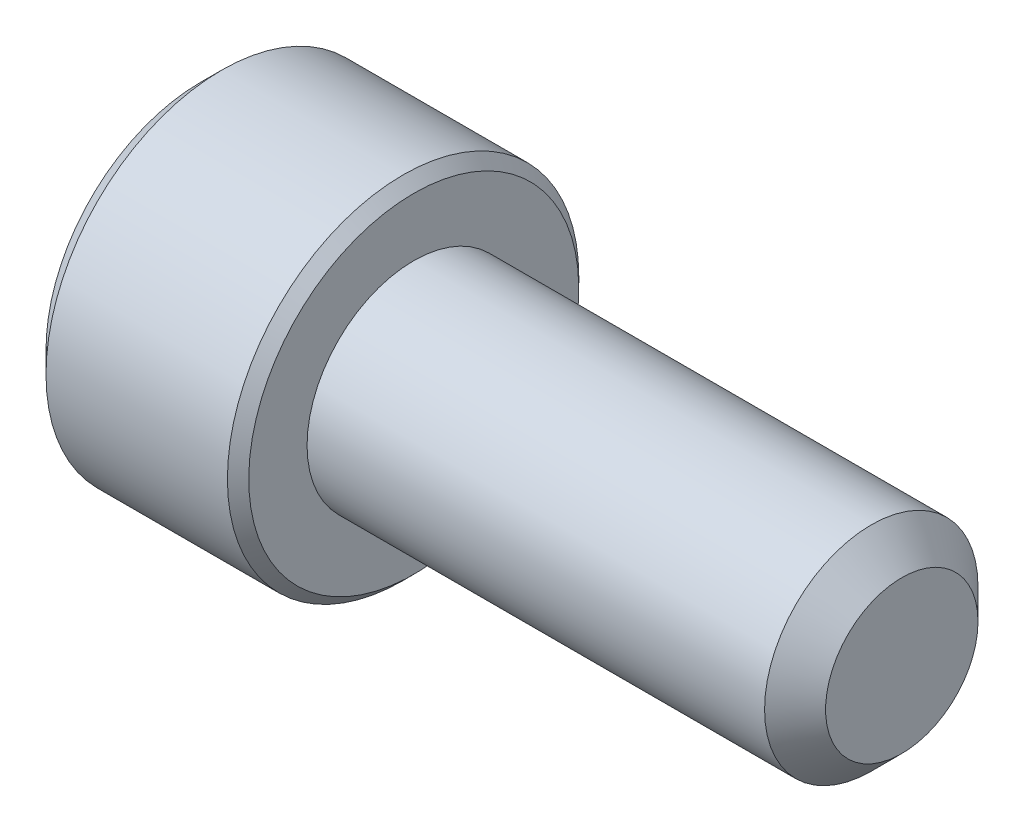
ISO-10303-21;
HEADER;
FILE_DESCRIPTION(('STEP AP214'),'2;1');
FILE_NAME('part.step','',(''),(''),'','','');
FILE_SCHEMA(('AUTOMOTIVE_DESIGN { 1 0 10303 214 1 1 1 1 }'));
ENDSEC;
DATA;
#1=APPLICATION_CONTEXT('core data for automotive mechanical design processes');
#2=APPLICATION_PROTOCOL_DEFINITION('international standard','automotive_design',2000,#1);
#3=PRODUCT_CONTEXT('',#1,'mechanical');
#4=PRODUCT('Part','Part','',(#3));
#5=PRODUCT_RELATED_PRODUCT_CATEGORY('part','',(#4));
#6=PRODUCT_DEFINITION_FORMATION('','',#4);
#7=PRODUCT_DEFINITION_CONTEXT('part definition',#1,'design');
#8=PRODUCT_DEFINITION('design','',#6,#7);
#9=PRODUCT_DEFINITION_SHAPE('','',#8);
#10=(LENGTH_UNIT() NAMED_UNIT(*) SI_UNIT(.MILLI.,.METRE.));
#11=(NAMED_UNIT(*) PLANE_ANGLE_UNIT() SI_UNIT($,.RADIAN.));
#12=(NAMED_UNIT(*) SI_UNIT($,.STERADIAN.) SOLID_ANGLE_UNIT());
#13=UNCERTAINTY_MEASURE_WITH_UNIT(LENGTH_MEASURE(1.E-05),#10,'distance_accuracy_value','');
#14=(GEOMETRIC_REPRESENTATION_CONTEXT(3) GLOBAL_UNCERTAINTY_ASSIGNED_CONTEXT((#13)) GLOBAL_UNIT_ASSIGNED_CONTEXT((#10,
#11,#12)) REPRESENTATION_CONTEXT('',''));
#15=CARTESIAN_POINT('',(0.,0.,0.));
#16=DIRECTION('',(0.,0.,1.));
#17=DIRECTION('',(1.,0.,0.));
#18=AXIS2_PLACEMENT_3D('',#15,#16,#17);
#19=CARTESIAN_POINT('',(-8.9281,3.01244,0.));
#20=DIRECTION('',(-1.,0.,0.));
#21=DIRECTION('',(0.,-1.,0.));
#22=AXIS2_PLACEMENT_3D('',#19,#20,#21);
#23=PLANE('',#22);
#24=CARTESIAN_POINT('',(-8.9281,0.,0.));
#25=DIRECTION('',(-1.,0.,0.));
#26=DIRECTION('',(0.,-1.,0.));
#27=AXIS2_PLACEMENT_3D('',#24,#25,#26);
#28=CIRCLE('',#27,2.06222299276167);
#29=CARTESIAN_POINT('',(-8.92810000000001,-2.06222299276165,0.));
#30=VERTEX_POINT('',#29);
#31=CARTESIAN_POINT('',(-8.9281,-1.03111149638088,1.78593749999994));
#32=VERTEX_POINT('',#31);
#33=EDGE_CURVE('E135',#30,#32,#28,.T.);
#34=ORIENTED_EDGE('',*,*,#33,.F.);
#35=CARTESIAN_POINT('',(-8.9281,-1.03111149638085,-1.7859375));
#36=VERTEX_POINT('',#35);
#37=EDGE_CURVE('E134',#36,#30,#28,.T.);
#38=ORIENTED_EDGE('',*,*,#37,.F.);
#39=CARTESIAN_POINT('',(-8.9281,1.03111149638082,-1.7859375));
#40=VERTEX_POINT('',#39);
#41=EDGE_CURVE('E103',#40,#36,#28,.T.);
#42=ORIENTED_EDGE('',*,*,#41,.F.);
#43=CARTESIAN_POINT('',(-8.92809999999999,2.06222299276169,0.));
#44=VERTEX_POINT('',#43);
#45=EDGE_CURVE('E96',#44,#40,#28,.T.);
#46=ORIENTED_EDGE('',*,*,#45,.F.);
#47=CARTESIAN_POINT('',(-8.9281,1.03111149638082,1.7859375));
#48=VERTEX_POINT('',#47);
#49=EDGE_CURVE('E57',#48,#44,#28,.T.);
#50=ORIENTED_EDGE('',*,*,#49,.F.);
#51=EDGE_CURVE('E64',#32,#48,#28,.T.);
#52=ORIENTED_EDGE('',*,*,#51,.F.);
#53=EDGE_LOOP('',(#34,#38,#42,#46,#50,#52));
#54=FACE_BOUND('',#53,.T.);
#55=CARTESIAN_POINT('',(-8.9281,0.,0.));
#56=DIRECTION('',(1.,0.,0.));
#57=DIRECTION('',(0.,1.,0.));
#58=AXIS2_PLACEMENT_3D('',#55,#56,#57);
#59=CIRCLE('',#58,3.01244);
#60=CARTESIAN_POINT('',(-8.9281,3.01244,0.));
#61=VERTEX_POINT('',#60);
#62=EDGE_CURVE('E228',#61,#61,#59,.T.);
#63=ORIENTED_EDGE('',*,*,#62,.F.);
#64=EDGE_LOOP('',(#63));
#65=FACE_BOUND('',#64,.T.);
#66=ADVANCED_FACE('F37',(#54,#65),#23,.T.);
#67=CARTESIAN_POINT('',(-4.7625,0.,0.));
#68=DIRECTION('',(1.,0.,0.));
#69=DIRECTION('',(0.,0.,-1.));
#70=AXIS2_PLACEMENT_3D('',#67,#68,#69);
#71=CYLINDRICAL_SURFACE('',#70,2.0828);
#72=CARTESIAN_POINT('',(4.1671875,0.,0.));
#73=DIRECTION('',(1.,0.,0.));
#74=DIRECTION('',(0.,0.,-1.));
#75=AXIS2_PLACEMENT_3D('',#72,#73,#74);
#76=CIRCLE('',#75,2.0828);
#77=CARTESIAN_POINT('',(4.1671875,0.,-2.0828));
#78=VERTEX_POINT('',#77);
#79=EDGE_CURVE('E51',#78,#78,#76,.F.);
#80=CARTESIAN_POINT('',(-4.7625,0.,0.));
#81=DIRECTION('',(1.,0.,0.));
#82=DIRECTION('',(0.,1.,0.));
#83=AXIS2_PLACEMENT_3D('',#80,#81,#82);
#84=CIRCLE('',#83,2.0828);
#85=CARTESIAN_POINT('',(-4.7625,0.,-2.0828));
#86=VERTEX_POINT('',#85);
#87=EDGE_CURVE('E221',#86,#86,#84,.F.);
#88=CARTESIAN_POINT('',(4.1671875,0.,-2.0828));
#89=CARTESIAN_POINT('',(4.074169921875,0.,-2.0828));
#90=CARTESIAN_POINT('',(3.98115234375,0.,-2.0828));
#91=CARTESIAN_POINT('',(3.7951171875,0.,-2.0828));
#92=CARTESIAN_POINT('',(3.702099609375,0.,-2.0828));
#93=CARTESIAN_POINT('',(3.516064453125,0.,-2.0828));
#94=CARTESIAN_POINT('',(3.423046875,0.,-2.0828));
#95=CARTESIAN_POINT('',(3.23701171875,0.,-2.0828));
#96=CARTESIAN_POINT('',(3.143994140625,0.,-2.0828));
#97=CARTESIAN_POINT('',(2.957958984375,0.,-2.0828));
#98=CARTESIAN_POINT('',(2.86494140625,0.,-2.0828));
#99=CARTESIAN_POINT('',(2.67890625,0.,-2.0828));
#100=CARTESIAN_POINT('',(2.585888671875,0.,-2.0828));
#101=CARTESIAN_POINT('',(2.399853515625,0.,-2.0828));
#102=CARTESIAN_POINT('',(2.3068359375,0.,-2.0828));
#103=CARTESIAN_POINT('',(2.12080078125,0.,-2.0828));
#104=CARTESIAN_POINT('',(2.027783203125,0.,-2.0828));
#105=CARTESIAN_POINT('',(1.841748046875,0.,-2.0828));
#106=CARTESIAN_POINT('',(1.74873046875,0.,-2.0828));
#107=CARTESIAN_POINT('',(1.5626953125,0.,-2.0828));
#108=CARTESIAN_POINT('',(1.469677734375,0.,-2.0828));
#109=CARTESIAN_POINT('',(1.283642578125,0.,-2.0828));
#110=CARTESIAN_POINT('',(1.190625,0.,-2.0828));
#111=CARTESIAN_POINT('',(1.00458984375,0.,-2.0828));
#112=CARTESIAN_POINT('',(0.911572265624999,0.,-2.0828));
#113=CARTESIAN_POINT('',(0.725537109375,0.,-2.0828));
#114=CARTESIAN_POINT('',(0.632519531249999,0.,-2.0828));
#115=CARTESIAN_POINT('',(0.446484374999999,0.,-2.0828));
#116=CARTESIAN_POINT('',(0.353466796874999,0.,-2.0828));
#117=CARTESIAN_POINT('',(0.167431640624999,0.,-2.0828));
#118=CARTESIAN_POINT('',(0.0744140624999992,0.,-2.0828));
#119=CARTESIAN_POINT('',(-0.111621093750001,0.,-2.0828));
#120=CARTESIAN_POINT('',(-0.204638671875001,0.,-2.0828));
#121=CARTESIAN_POINT('',(-0.390673828125001,0.,-2.0828));
#122=CARTESIAN_POINT('',(-0.483691406250001,0.,-2.0828));
#123=CARTESIAN_POINT('',(-0.669726562500001,0.,-2.0828));
#124=CARTESIAN_POINT('',(-0.762744140625001,0.,-2.0828));
#125=CARTESIAN_POINT('',(-0.948779296875001,0.,-2.0828));
#126=CARTESIAN_POINT('',(-1.041796875,0.,-2.0828));
#127=CARTESIAN_POINT('',(-1.22783203125,0.,-2.0828));
#128=CARTESIAN_POINT('',(-1.320849609375,0.,-2.0828));
#129=CARTESIAN_POINT('',(-1.506884765625,0.,-2.0828));
#130=CARTESIAN_POINT('',(-1.59990234375,0.,-2.0828));
#131=CARTESIAN_POINT('',(-1.7859375,0.,-2.0828));
#132=CARTESIAN_POINT('',(-1.878955078125,0.,-2.0828));
#133=CARTESIAN_POINT('',(-2.064990234375,0.,-2.0828));
#134=CARTESIAN_POINT('',(-2.1580078125,0.,-2.0828));
#135=CARTESIAN_POINT('',(-2.34404296875,0.,-2.0828));
#136=CARTESIAN_POINT('',(-2.437060546875,0.,-2.0828));
#137=CARTESIAN_POINT('',(-2.623095703125,0.,-2.0828));
#138=CARTESIAN_POINT('',(-2.71611328125,0.,-2.0828));
#139=CARTESIAN_POINT('',(-2.9021484375,0.,-2.0828));
#140=CARTESIAN_POINT('',(-2.995166015625,0.,-2.0828));
#141=CARTESIAN_POINT('',(-3.181201171875,0.,-2.0828));
#142=CARTESIAN_POINT('',(-3.27421875,0.,-2.0828));
#143=CARTESIAN_POINT('',(-3.46025390625,0.,-2.0828));
#144=CARTESIAN_POINT('',(-3.553271484375,0.,-2.0828));
#145=CARTESIAN_POINT('',(-3.739306640625,0.,-2.0828));
#146=CARTESIAN_POINT('',(-3.83232421875,0.,-2.0828));
#147=CARTESIAN_POINT('',(-4.018359375,0.,-2.0828));
#148=CARTESIAN_POINT('',(-4.111376953125,0.,-2.0828));
#149=CARTESIAN_POINT('',(-4.297412109375,0.,-2.0828));
#150=CARTESIAN_POINT('',(-4.3904296875,0.,-2.0828));
#151=CARTESIAN_POINT('',(-4.57646484375,0.,-2.0828));
#152=CARTESIAN_POINT('',(-4.669482421875,0.,-2.0828));
#153=CARTESIAN_POINT('',(-4.7625,0.,-2.0828));
#154=B_SPLINE_CURVE_WITH_KNOTS('',3,(#88,#89,#90,#91,#92,#93,#94,#95,#96,#97,#98,#99,#100,#101,
#102,#103,#104,#105,#106,#107,#108,#109,#110,#111,#112,#113,#114,#115,#116,#117,#118,#119,#120,
#121,#122,#123,#124,#125,#126,#127,#128,#129,#130,#131,#132,#133,#134,#135,#136,#137,#138,#139,
#140,#141,#142,#143,#144,#145,#146,#147,#148,#149,#150,#151,#152,#153),.UNSPECIFIED.,.F.,.F.,(4,
2,2,2,2,2,2,2,2,2,2,2,2,2,2,2,2,2,2,2,2,2,2,2,2,2,2,2,2,2,2,2,4),(0.,0.279052734375,
0.55810546875,0.837158203125,1.1162109375,1.395263671875,1.67431640625,1.953369140625,
2.232421875,2.511474609375,2.79052734375,3.069580078125,3.3486328125,3.627685546875,
3.90673828125,4.185791015625,4.46484375,4.743896484375,5.02294921875,5.302001953125,
5.5810546875,5.860107421875,6.13916015625,6.418212890625,6.697265625,6.976318359375,
7.25537109375,7.534423828125,7.8134765625,8.092529296875,8.37158203125,8.650634765625,
8.9296875),.UNSPECIFIED.);
#155=EDGE_CURVE('BSEAM201',#78,#86,#154,.T.);
#156=ORIENTED_EDGE('',*,*,#79,.T.);
#157=ORIENTED_EDGE('',*,*,#87,.F.);
#158=ORIENTED_EDGE('',*,*,#155,.T.);
#159=ORIENTED_EDGE('',*,*,#155,.F.);
#160=EDGE_LOOP('',(#156,#158,#157,#159));
#161=FACE_BOUND('',#160,.T.);
#162=ADVANCED_FACE('F201',(#161),#71,.T.);
#163=CARTESIAN_POINT('',(4.7625,0.,0.));
#164=DIRECTION('',(1.,0.,0.));
#165=DIRECTION('',(0.,0.,-1.));
#166=AXIS2_PLACEMENT_3D('',#163,#164,#165);
#167=PLANE('',#166);
#168=CARTESIAN_POINT('',(4.7625,0.,0.));
#169=DIRECTION('',(1.,0.,0.));
#170=DIRECTION('',(0.,0.,-1.));
#171=AXIS2_PLACEMENT_3D('',#168,#169,#170);
#172=CIRCLE('',#171,1.4874875);
#173=CARTESIAN_POINT('',(4.7625,0.,-1.4874875));
#174=VERTEX_POINT('',#173);
#175=EDGE_CURVE('E222',#174,#174,#172,.T.);
#176=ORIENTED_EDGE('',*,*,#175,.T.);
#177=EDGE_LOOP('',(#176));
#178=FACE_BOUND('',#177,.T.);
#179=ADVANCED_FACE('F209',(#178),#167,.T.);
#180=CARTESIAN_POINT('',(4.7625,0.,0.));
#181=DIRECTION('',(-1.,0.,0.));
#182=DIRECTION('',(0.,0.,1.));
#183=AXIS2_PLACEMENT_3D('',#180,#181,#182);
#184=CONICAL_SURFACE('',#183,1.4874875,0.785398163397447);
#185=ORIENTED_EDGE('',*,*,#79,.F.);
#186=EDGE_LOOP('',(#185));
#187=FACE_BOUND('',#186,.T.);
#188=ORIENTED_EDGE('',*,*,#175,.F.);
#189=EDGE_LOOP('',(#188));
#190=FACE_BOUND('',#189,.T.);
#191=ADVANCED_FACE('F39',(#187,#190),#184,.T.);
#192=CARTESIAN_POINT('',(-4.7625,0.,0.));
#193=DIRECTION('',(1.,0.,0.));
#194=DIRECTION('',(0.,1.,0.));
#195=AXIS2_PLACEMENT_3D('',#192,#193,#194);
#196=CYLINDRICAL_SURFACE('',#195,3.429);
#197=CARTESIAN_POINT('',(-8.51154,0.,0.));
#198=DIRECTION('',(1.,0.,0.));
#199=DIRECTION('',(0.,1.,0.));
#200=AXIS2_PLACEMENT_3D('',#197,#198,#199);
#201=CIRCLE('',#200,3.429);
#202=CARTESIAN_POINT('',(-8.51154,3.429,0.));
#203=VERTEX_POINT('',#202);
#204=EDGE_CURVE('E223',#203,#203,#201,.T.);
#205=ORIENTED_EDGE('',*,*,#204,.T.);
#206=EDGE_LOOP('',(#205));
#207=FACE_BOUND('',#206,.T.);
#208=CARTESIAN_POINT('',(-4.97078,0.,0.));
#209=DIRECTION('',(1.,0.,0.));
#210=DIRECTION('',(0.,1.,0.));
#211=AXIS2_PLACEMENT_3D('',#208,#209,#210);
#212=CIRCLE('',#211,3.429);
#213=CARTESIAN_POINT('',(-4.97078,3.429,0.));
#214=VERTEX_POINT('',#213);
#215=EDGE_CURVE('E238',#214,#214,#212,.T.);
#216=ORIENTED_EDGE('',*,*,#215,.F.);
#217=EDGE_LOOP('',(#216));
#218=FACE_BOUND('',#217,.T.);
#219=ADVANCED_FACE('F204',(#207,#218),#196,.T.);
#220=CARTESIAN_POINT('',(-8.51154,0.,0.));
#221=DIRECTION('',(1.,0.,0.));
#222=DIRECTION('',(0.,1.,0.));
#223=AXIS2_PLACEMENT_3D('',#220,#221,#222);
#224=CONICAL_SURFACE('',#223,3.429,0.785398163397451);
#225=ORIENTED_EDGE('',*,*,#62,.T.);
#226=EDGE_LOOP('',(#225));
#227=FACE_BOUND('',#226,.T.);
#228=ORIENTED_EDGE('',*,*,#204,.F.);
#229=EDGE_LOOP('',(#228));
#230=FACE_BOUND('',#229,.T.);
#231=ADVANCED_FACE('F197',(#227,#230),#224,.T.);
#232=CARTESIAN_POINT('',(-4.7625,3.22072,0.));
#233=DIRECTION('',(1.,0.,0.));
#234=DIRECTION('',(0.,1.,0.));
#235=AXIS2_PLACEMENT_3D('',#232,#233,#234);
#236=PLANE('',#235);
#237=ORIENTED_EDGE('',*,*,#87,.T.);
#238=EDGE_LOOP('',(#237));
#239=FACE_BOUND('',#238,.T.);
#240=CARTESIAN_POINT('',(-4.7625,0.,0.));
#241=DIRECTION('',(1.,0.,0.));
#242=DIRECTION('',(0.,1.,0.));
#243=AXIS2_PLACEMENT_3D('',#240,#241,#242);
#244=CIRCLE('',#243,3.22072);
#245=CARTESIAN_POINT('',(-4.7625,3.22072,0.));
#246=VERTEX_POINT('',#245);
#247=EDGE_CURVE('E234',#246,#246,#244,.T.);
#248=ORIENTED_EDGE('',*,*,#247,.T.);
#249=EDGE_LOOP('',(#248));
#250=FACE_BOUND('',#249,.T.);
#251=ADVANCED_FACE('F193',(#239,#250),#236,.T.);
#252=CARTESIAN_POINT('',(-4.7625,0.,0.));
#253=DIRECTION('',(-1.,0.,0.));
#254=DIRECTION('',(0.,-1.,0.));
#255=AXIS2_PLACEMENT_3D('',#252,#253,#254);
#256=CONICAL_SURFACE('',#255,3.22072,0.78539816339745);
#257=ORIENTED_EDGE('',*,*,#215,.T.);
#258=EDGE_LOOP('',(#257));
#259=FACE_BOUND('',#258,.T.);
#260=ORIENTED_EDGE('',*,*,#247,.F.);
#261=EDGE_LOOP('',(#260));
#262=FACE_BOUND('',#261,.T.);
#263=ADVANCED_FACE('F157',(#259,#262),#256,.T.);
#264=CARTESIAN_POINT('',(-8.9281,0.,0.));
#265=DIRECTION('',(-1.,0.,0.));
#266=DIRECTION('',(0.,-1.,0.));
#267=AXIS2_PLACEMENT_3D('',#264,#265,#266);
#268=CONICAL_SURFACE('',#267,2.06222299276167,0.78539816339745);
#269=CARTESIAN_POINT('',(-9.61928523434825,-2.09563453665237,-1.7859375));
#270=CARTESIAN_POINT('',(-9.580588492197,-2.0447809048946,-1.7859375));
#271=CARTESIAN_POINT('',(-9.54225494053677,-1.99364692948856,-1.7859375));
#272=CARTESIAN_POINT('',(-9.46647640865997,-1.89070614195156,-1.7859375));
#273=CARTESIAN_POINT('',(-9.42903164839754,-1.83889916807836,-1.7859375));
#274=CARTESIAN_POINT('',(-9.35492642113068,-1.73412124596953,-1.7859375));
#275=CARTESIAN_POINT('',(-9.31827426453624,-1.68114439306555,-1.7859375));
#276=CARTESIAN_POINT('',(-9.24630469238999,-1.57429811298924,-1.7859375));
#277=CARTESIAN_POINT('',(-9.2109871835941,-1.52042874855115,-1.7859375));
#278=CARTESIAN_POINT('',(-9.10332831198427,-1.35078415342913,-1.7859375));
#279=CARTESIAN_POINT('',(-9.03378811193563,-1.23320005252216,-1.7859375));
#280=CARTESIAN_POINT('',(-8.90633072773463,-0.992118731748864,-1.7859375));
#281=CARTESIAN_POINT('',(-8.84837431655709,-0.868643284729314,-1.7859375));
#282=CARTESIAN_POINT('',(-8.77745875511724,-0.683674652153123,-1.7859375));
#283=CARTESIAN_POINT('',(-8.75717265928591,-0.625004650907837,-1.7859375));
#284=CARTESIAN_POINT('',(-8.72130619437113,-0.506214164289233,-1.7859375));
#285=CARTESIAN_POINT('',(-8.70572613880356,-0.446093582566405,-1.7859375));
#286=CARTESIAN_POINT('',(-8.68035211358695,-0.325784651702854,-1.7859375));
#287=CARTESIAN_POINT('',(-8.67045657549075,-0.265618070156216,-1.7859375));
#288=CARTESIAN_POINT('',(-8.65665115934767,-0.144598166167728,-1.7859375));
#289=CARTESIAN_POINT('',(-8.65274016818319,-0.0837449735562863,-1.7859375));
#290=CARTESIAN_POINT('',(-8.65121178247669,0.0356547594903819,-1.7859375));
#291=CARTESIAN_POINT('',(-8.6533538738026,0.0941982873561517,-1.7859375));
#292=CARTESIAN_POINT('',(-8.66327343432894,0.210802559086132,-1.7859375));
#293=CARTESIAN_POINT('',(-8.67105143709622,0.268863256713056,-1.7859375));
#294=CARTESIAN_POINT('',(-8.69194372517907,0.385065185306248,-1.7859375));
#295=CARTESIAN_POINT('',(-8.70515021101683,0.443189579570887,-1.7859375));
#296=CARTESIAN_POINT('',(-8.736185799116,0.558163289769264,-1.7859375));
#297=CARTESIAN_POINT('',(-8.75401456479291,0.615012698217378,-1.7859375));
#298=CARTESIAN_POINT('',(-8.81635259762895,0.792248692312396,-1.7859375));
#299=CARTESIAN_POINT('',(-8.86788823512846,0.91015606550762,-1.7859375));
#300=CARTESIAN_POINT('',(-8.98251845281837,1.14045583851695,-1.7859375));
#301=CARTESIAN_POINT('',(-9.04565421177193,1.25282672291039,-1.7859375));
#302=CARTESIAN_POINT('',(-9.14421243290734,1.41525294874865,-1.7859375));
#303=CARTESIAN_POINT('',(-9.17679321964248,1.4670670743613,-1.7859375));
#304=CARTESIAN_POINT('',(-9.24333876714302,1.56980582337911,-1.7859375));
#305=CARTESIAN_POINT('',(-9.27730363228858,1.62073037928215,-1.7859375));
#306=CARTESIAN_POINT('',(-9.34608508305999,1.72139456098408,-1.7859375));
#307=CARTESIAN_POINT('',(-9.38089256724863,1.77114043687783,-1.7859375));
#308=CARTESIAN_POINT('',(-9.45143384500662,1.86995112716331,-1.7859375));
#309=CARTESIAN_POINT('',(-9.48716738087682,1.91901612531428,-1.7859375));
#310=CARTESIAN_POINT('',(-9.52328046765412,1.96779582211257,-1.7859375));
#311=B_SPLINE_CURVE_WITH_KNOTS('',3,(#269,#270,#271,#272,#273,#274,#275,#276,#277,#278,#279,
#280,#281,#282,#283,#284,#285,#286,#287,#288,#289,#290,#291,#292,#293,#294,#295,#296,#297,#298,
#299,#300,#301,#302,#303,#304,#305,#306,#307,#308,#309,#310),.UNSPECIFIED.,.F.,.F.,(4,2,2,2,2,2,
2,2,2,2,2,2,2,2,2,2,2,2,2,2,4),(0.,0.191710360695483,0.383467680532776,0.57670874570052,
0.769936285183932,1.17942060906159,1.58749385376466,1.77357127945245,1.95966109886439,
2.14231332379617,2.32493157153048,2.50039682895608,2.67587870031868,2.85447301898584,
3.03305433644855,3.41796586723903,3.80427114714395,3.98787271768852,4.17148816024692,
4.35361971578598,4.5357011212407),.UNSPECIFIED.);
#312=EDGE_CURVE('E11',#36,#40,#311,.T.);
#313=ORIENTED_EDGE('',*,*,#312,.T.);
#314=ORIENTED_EDGE('',*,*,#41,.T.);
#315=EDGE_LOOP('',(#313,#314));
#316=FACE_BOUND('',#315,.T.);
#317=ADVANCED_FACE('F108',(#316),#268,.F.);
#318=CARTESIAN_POINT('',(-8.92821547975162,-2.06233846281553,0.000200000000000496));
#319=CARTESIAN_POINT('',(-8.89279683020536,-2.02689169571862,-0.0611956015759149));
#320=CARTESIAN_POINT('',(-8.85945817815093,-1.9908521875094,-0.123617860874081));
#321=CARTESIAN_POINT('',(-8.79841555920554,-1.91736352360555,-0.250903960535891));
#322=CARTESIAN_POINT('',(-8.77074556212519,-1.87990737683499,-0.31577990979827));
#323=CARTESIAN_POINT('',(-8.7233461265528,-1.8043788190457,-0.446599209311718));
#324=CARTESIAN_POINT('',(-8.70349753428616,-1.76632564883049,-0.512509233513537));
#325=CARTESIAN_POINT('',(-8.67291648161432,-1.68938146013435,-0.645780477682407));
#326=CARTESIAN_POINT('',(-8.66216118864127,-1.65049279308089,-0.713137624857642));
#327=CARTESIAN_POINT('',(-8.65245725595893,-1.58347212872989,-0.829220820670585));
#328=CARTESIAN_POINT('',(-8.6510205454531,-1.55542674587864,-0.877796848686679));
#329=CARTESIAN_POINT('',(-8.6534394477888,-1.49938180121945,-0.974869540343774));
#330=CARTESIAN_POINT('',(-8.6572969161715,-1.47138225892219,-1.0233661701913));
#331=CARTESIAN_POINT('',(-8.67008288274397,-1.41565525146079,-1.11988817846822));
#332=CARTESIAN_POINT('',(-8.67901565371551,-1.38792803559618,-1.16791312509816));
#333=CARTESIAN_POINT('',(-8.70146731414227,-1.33293767519576,-1.2631592232382));
#334=CARTESIAN_POINT('',(-8.71498838643809,-1.30567475804083,-1.31037998091307));
#335=CARTESIAN_POINT('',(-8.75512737463413,-1.23584830305774,-1.43132294865622));
#336=CARTESIAN_POINT('',(-8.78477078390698,-1.19371769999614,-1.50429529371243));
#337=CARTESIAN_POINT('',(-8.83481349025407,-1.13176851608183,-1.61159442773944));
#338=CARTESIAN_POINT('',(-8.85239628377401,-1.11135351796506,-1.64695424171411));
#339=CARTESIAN_POINT('',(-8.88916476914811,-1.07090173762354,-1.71701878052223));
#340=CARTESIAN_POINT('',(-8.908349476289,-1.05086473219594,-1.75172389195438));
#341=CARTESIAN_POINT('',(-8.92821547975161,-1.03099602632701,-1.7861375));
#342=B_SPLINE_CURVE_WITH_KNOTS('',3,(#318,#319,#320,#321,#322,#323,#324,#325,#326,#327,#328,
#329,#330,#331,#332,#333,#334,#335,#336,#337,#338,#339,#340,#341),.UNSPECIFIED.,.F.,.F.,(4,2,2,
2,2,2,2,2,2,2,2,4),(0.,0.237911140423803,0.477208767673633,0.712705150046286,0.947608448198484,
1.11569769827264,1.28384587649988,1.45213582505428,1.62050594845157,1.8879149571291,
2.02125696737758,2.15451760593925),.UNSPECIFIED.);
#343=EDGE_CURVE('E137',#30,#36,#342,.T.);
#344=ORIENTED_EDGE('',*,*,#343,.T.);
#345=ORIENTED_EDGE('',*,*,#37,.T.);
#346=EDGE_LOOP('',(#344,#345));
#347=FACE_BOUND('',#346,.T.);
#348=ADVANCED_FACE('F156',(#347),#268,.F.);
#349=CARTESIAN_POINT('',(-8.92821547975161,-1.03099602632701,1.7861375));
#350=CARTESIAN_POINT('',(-8.89279683020535,-1.06644279342392,1.72474189842408));
#351=CARTESIAN_POINT('',(-8.85945817815091,-1.10248230163314,1.66231963912592));
#352=CARTESIAN_POINT('',(-8.79841555920553,-1.17597096553699,1.53503353946411));
#353=CARTESIAN_POINT('',(-8.77074556212518,-1.21342711230755,1.47015759020174));
#354=CARTESIAN_POINT('',(-8.72334612655279,-1.28895567009684,1.33933829068829));
#355=CARTESIAN_POINT('',(-8.70349753428615,-1.32700884031205,1.27342826648647));
#356=CARTESIAN_POINT('',(-8.67291648161432,-1.40395302900818,1.14015702231761));
#357=CARTESIAN_POINT('',(-8.66216118864127,-1.44284169606165,1.07279987514237));
#358=CARTESIAN_POINT('',(-8.65245725595893,-1.50986236041264,0.956716679329431));
#359=CARTESIAN_POINT('',(-8.6510205454531,-1.5379077432639,0.908140651313337));
#360=CARTESIAN_POINT('',(-8.6534394477888,-1.59395268792308,0.811067959656243));
#361=CARTESIAN_POINT('',(-8.6572969161715,-1.62195223022034,0.762571329808718));
#362=CARTESIAN_POINT('',(-8.67008288274397,-1.67767923768174,0.666049321531801));
#363=CARTESIAN_POINT('',(-8.67901565371551,-1.70540645354636,0.618024374901861));
#364=CARTESIAN_POINT('',(-8.70146731414227,-1.76039681394677,0.522778276761821));
#365=CARTESIAN_POINT('',(-8.71498838643809,-1.7876597311017,0.475557519086943));
#366=CARTESIAN_POINT('',(-8.75512737463414,-1.8574861860848,0.354614551343794));
#367=CARTESIAN_POINT('',(-8.78477078390699,-1.8996167891464,0.281642206287581));
#368=CARTESIAN_POINT('',(-8.83481349025408,-1.96156597306071,0.17434307226057));
#369=CARTESIAN_POINT('',(-8.85239628377402,-1.98198097117748,0.138983258285893));
#370=CARTESIAN_POINT('',(-8.88916476914812,-2.022432751519,0.0689187194777746));
#371=CARTESIAN_POINT('',(-8.90834947628901,-2.04246975694661,0.0342136080456212));
#372=CARTESIAN_POINT('',(-8.92821547975162,-2.06233846281553,-0.000199999999999771));
#373=B_SPLINE_CURVE_WITH_KNOTS('',3,(#349,#350,#351,#352,#353,#354,#355,#356,#357,#358,#359,
#360,#361,#362,#363,#364,#365,#366,#367,#368,#369,#370,#371,#372),.UNSPECIFIED.,.F.,.F.,(4,2,2,
2,2,2,2,2,2,2,2,4),(0.,0.237911140423796,0.477208767673621,0.712705150046267,0.94760844819846,
1.11569769827262,1.28384587649985,1.45213582505426,1.62050594845155,1.88791495712909,
2.02125696737758,2.15451760593925),.UNSPECIFIED.);
#374=EDGE_CURVE('E144',#32,#30,#373,.T.);
#375=ORIENTED_EDGE('',*,*,#374,.T.);
#376=ORIENTED_EDGE('',*,*,#33,.T.);
#377=EDGE_LOOP('',(#375,#376));
#378=FACE_BOUND('',#377,.T.);
#379=ADVANCED_FACE('F280',(#378),#268,.F.);
#380=CARTESIAN_POINT('',(-9.61928523434825,-2.09563453665237,1.7859375));
#381=CARTESIAN_POINT('',(-9.580588492197,-2.0447809048946,1.7859375));
#382=CARTESIAN_POINT('',(-9.54225494053677,-1.99364692948856,1.7859375));
#383=CARTESIAN_POINT('',(-9.46647640865997,-1.89070614195156,1.7859375));
#384=CARTESIAN_POINT('',(-9.42903164839754,-1.83889916807836,1.7859375));
#385=CARTESIAN_POINT('',(-9.35492642113068,-1.73412124596953,1.7859375));
#386=CARTESIAN_POINT('',(-9.31827426453624,-1.68114439306555,1.7859375));
#387=CARTESIAN_POINT('',(-9.24630469238999,-1.57429811298924,1.7859375));
#388=CARTESIAN_POINT('',(-9.2109871835941,-1.52042874855115,1.7859375));
#389=CARTESIAN_POINT('',(-9.10332831198427,-1.35078415342913,1.7859375));
#390=CARTESIAN_POINT('',(-9.03378811193563,-1.23320005252216,1.7859375));
#391=CARTESIAN_POINT('',(-8.90633072773463,-0.992118731748865,1.7859375));
#392=CARTESIAN_POINT('',(-8.84837431655709,-0.868643284729315,1.7859375));
#393=CARTESIAN_POINT('',(-8.77745875511724,-0.683674652153123,1.7859375));
#394=CARTESIAN_POINT('',(-8.75717265928591,-0.625004650907837,1.7859375));
#395=CARTESIAN_POINT('',(-8.72130619437113,-0.506214164289234,1.7859375));
#396=CARTESIAN_POINT('',(-8.70572613880356,-0.446093582566406,1.7859375));
#397=CARTESIAN_POINT('',(-8.68035211358695,-0.325784651702854,1.7859375));
#398=CARTESIAN_POINT('',(-8.67045657549075,-0.265618070156215,1.7859375));
#399=CARTESIAN_POINT('',(-8.65665115934767,-0.144598166167728,1.7859375));
#400=CARTESIAN_POINT('',(-8.65274016818319,-0.0837449735562863,1.7859375));
#401=CARTESIAN_POINT('',(-8.65121178247669,0.0356547594903817,1.7859375));
#402=CARTESIAN_POINT('',(-8.6533538738026,0.0941982873561515,1.7859375));
#403=CARTESIAN_POINT('',(-8.66327343432894,0.210802559086132,1.7859375));
#404=CARTESIAN_POINT('',(-8.67105143709622,0.268863256713056,1.7859375));
#405=CARTESIAN_POINT('',(-8.69194372517907,0.385065185306247,1.7859375));
#406=CARTESIAN_POINT('',(-8.70515021101683,0.443189579570887,1.7859375));
#407=CARTESIAN_POINT('',(-8.736185799116,0.558163289769264,1.7859375));
#408=CARTESIAN_POINT('',(-8.75401456479291,0.615012698217378,1.7859375));
#409=CARTESIAN_POINT('',(-8.81635259762895,0.792248692312395,1.7859375));
#410=CARTESIAN_POINT('',(-8.86788823512846,0.910156065507619,1.7859375));
#411=CARTESIAN_POINT('',(-8.98251845281837,1.14045583851695,1.7859375));
#412=CARTESIAN_POINT('',(-9.04565421177193,1.25282672291039,1.7859375));
#413=CARTESIAN_POINT('',(-9.14421243290734,1.41525294874865,1.7859375));
#414=CARTESIAN_POINT('',(-9.17679321964248,1.4670670743613,1.7859375));
#415=CARTESIAN_POINT('',(-9.24333876714302,1.56980582337911,1.7859375));
#416=CARTESIAN_POINT('',(-9.27730363228858,1.62073037928215,1.7859375));
#417=CARTESIAN_POINT('',(-9.34608508305999,1.72139456098408,1.7859375));
#418=CARTESIAN_POINT('',(-9.38089256724863,1.77114043687783,1.7859375));
#419=CARTESIAN_POINT('',(-9.45143384500662,1.86995112716331,1.7859375));
#420=CARTESIAN_POINT('',(-9.48716738087682,1.91901612531428,1.7859375));
#421=CARTESIAN_POINT('',(-9.52328046765412,1.96779582211257,1.7859375));
#422=B_SPLINE_CURVE_WITH_KNOTS('',3,(#380,#381,#382,#383,#384,#385,#386,#387,#388,#389,#390,
#391,#392,#393,#394,#395,#396,#397,#398,#399,#400,#401,#402,#403,#404,#405,#406,#407,#408,#409,
#410,#411,#412,#413,#414,#415,#416,#417,#418,#419,#420,#421),.UNSPECIFIED.,.F.,.F.,(4,2,2,2,2,2,
2,2,2,2,2,2,2,2,2,2,2,2,2,2,4),(0.,0.191710360695484,0.383467680532776,0.576708745700519,
0.769936285183932,1.17942060906159,1.58749385376466,1.77357127945245,1.95966109886439,
2.14231332379617,2.32493157153048,2.50039682895608,2.67587870031868,2.85447301898584,
3.03305433644855,3.41796586723903,3.80427114714395,3.98787271768852,4.17148816024692,
4.35361971578598,4.5357011212407),.UNSPECIFIED.);
#423=EDGE_CURVE('E164',#48,#32,#422,.F.);
#424=ORIENTED_EDGE('',*,*,#423,.T.);
#425=ORIENTED_EDGE('',*,*,#51,.T.);
#426=EDGE_LOOP('',(#424,#425));
#427=FACE_BOUND('',#426,.T.);
#428=ADVANCED_FACE('F287',(#427),#268,.F.);
#429=CARTESIAN_POINT('',(-8.92821547975156,2.06233846281553,-0.000200000000000077));
#430=CARTESIAN_POINT('',(-8.89279683020531,2.02689169571862,0.0611956015759149));
#431=CARTESIAN_POINT('',(-8.85945817815087,1.9908521875094,0.12361786087408));
#432=CARTESIAN_POINT('',(-8.79841555920549,1.91736352360556,0.250903960535887));
#433=CARTESIAN_POINT('',(-8.77074556212513,1.87990737683499,0.315779909798265));
#434=CARTESIAN_POINT('',(-8.72334612655275,1.8043788190457,0.446599209311709));
#435=CARTESIAN_POINT('',(-8.7034975342861,1.76632564883049,0.512509233513528));
#436=CARTESIAN_POINT('',(-8.67291648161428,1.68938146013436,0.645780477682396));
#437=CARTESIAN_POINT('',(-8.66216118864123,1.65049279308089,0.713137624857629));
#438=CARTESIAN_POINT('',(-8.65245725595888,1.5834721287299,0.82922082067057));
#439=CARTESIAN_POINT('',(-8.65102054545305,1.55542674587864,0.877796848686664));
#440=CARTESIAN_POINT('',(-8.65343944778875,1.49938180121946,0.974869540343757));
#441=CARTESIAN_POINT('',(-8.65729691617145,1.4713822589222,1.02336617019128));
#442=CARTESIAN_POINT('',(-8.67008288274392,1.4156552514608,1.1198881784682));
#443=CARTESIAN_POINT('',(-8.67901565371547,1.38792803559619,1.16791312509814));
#444=CARTESIAN_POINT('',(-8.70146731414222,1.33293767519578,1.26315922323817));
#445=CARTESIAN_POINT('',(-8.71498838643804,1.30567475804085,1.31037998091305));
#446=CARTESIAN_POINT('',(-8.75512737463409,1.23584830305775,1.4313229486562));
#447=CARTESIAN_POINT('',(-8.78477078390694,1.19371769999614,1.50429529371241));
#448=CARTESIAN_POINT('',(-8.83481349025404,1.13176851608184,1.61159442773943));
#449=CARTESIAN_POINT('',(-8.85239628377397,1.11135351796506,1.6469542417141));
#450=CARTESIAN_POINT('',(-8.88916476914808,1.07090173762355,1.71701878052222));
#451=CARTESIAN_POINT('',(-8.90834947628897,1.05086473219594,1.75172389195438));
#452=CARTESIAN_POINT('',(-8.92821547975158,1.03099602632701,1.7861375));
#453=B_SPLINE_CURVE_WITH_KNOTS('',3,(#429,#430,#431,#432,#433,#434,#435,#436,#437,#438,#439,
#440,#441,#442,#443,#444,#445,#446,#447,#448,#449,#450,#451,#452),.UNSPECIFIED.,.F.,.F.,(4,2,2,
2,2,2,2,2,2,2,2,4),(0.,0.237911140423797,0.477208767673624,0.712705150046271,0.947608448198464,
1.11569769827262,1.28384587649985,1.45213582505426,1.62050594845154,1.88791495712908,
2.02125696737758,2.15451760593925),.UNSPECIFIED.);
#454=EDGE_CURVE('E123',#44,#48,#453,.T.);
#455=ORIENTED_EDGE('',*,*,#454,.T.);
#456=ORIENTED_EDGE('',*,*,#49,.T.);
#457=EDGE_LOOP('',(#455,#456));
#458=FACE_BOUND('',#457,.T.);
#459=ADVANCED_FACE('F294',(#458),#268,.F.);
#460=CARTESIAN_POINT('',(-8.92821547975158,1.03099602632701,-1.7861375));
#461=CARTESIAN_POINT('',(-8.89279683020532,1.06644279342392,-1.72474189842408));
#462=CARTESIAN_POINT('',(-8.85945817815088,1.10248230163314,-1.66231963912592));
#463=CARTESIAN_POINT('',(-8.7984155592055,1.17597096553699,-1.53503353946411));
#464=CARTESIAN_POINT('',(-8.77074556212514,1.21342711230755,-1.47015759020173));
#465=CARTESIAN_POINT('',(-8.72334612655275,1.28895567009684,-1.33933829068828));
#466=CARTESIAN_POINT('',(-8.70349753428611,1.32700884031206,-1.27342826648646));
#467=CARTESIAN_POINT('',(-8.67291648161428,1.40395302900819,-1.14015702231759));
#468=CARTESIAN_POINT('',(-8.66216118864123,1.44284169606166,-1.07279987514236));
#469=CARTESIAN_POINT('',(-8.65245725595888,1.50986236041265,-0.956716679329416));
#470=CARTESIAN_POINT('',(-8.65102054545305,1.53790774326391,-0.908140651313322));
#471=CARTESIAN_POINT('',(-8.65343944778875,1.59395268792309,-0.811067959656229));
#472=CARTESIAN_POINT('',(-8.65729691617145,1.62195223022035,-0.762571329808705));
#473=CARTESIAN_POINT('',(-8.67008288274392,1.67767923768175,-0.66604932153179));
#474=CARTESIAN_POINT('',(-8.67901565371546,1.70540645354636,-0.61802437490185));
#475=CARTESIAN_POINT('',(-8.70146731414222,1.76039681394677,-0.522778276761811));
#476=CARTESIAN_POINT('',(-8.71498838643804,1.7876597311017,-0.475557519086934));
#477=CARTESIAN_POINT('',(-8.75512737463409,1.8574861860848,-0.354614551343787));
#478=CARTESIAN_POINT('',(-8.78477078390693,1.8996167891464,-0.281642206287575));
#479=CARTESIAN_POINT('',(-8.83481349025403,1.96156597306071,-0.174343072260567));
#480=CARTESIAN_POINT('',(-8.85239628377396,1.98198097117748,-0.13898325828589));
#481=CARTESIAN_POINT('',(-8.88916476914807,2.022432751519,-0.0689187194777733));
#482=CARTESIAN_POINT('',(-8.90834947628896,2.04246975694661,-0.0342136080456203));
#483=CARTESIAN_POINT('',(-8.92821547975156,2.06233846281553,0.000200000000000391));
#484=B_SPLINE_CURVE_WITH_KNOTS('',3,(#460,#461,#462,#463,#464,#465,#466,#467,#468,#469,#470,
#471,#472,#473,#474,#475,#476,#477,#478,#479,#480,#481,#482,#483),.UNSPECIFIED.,.F.,.F.,(4,2,2,
2,2,2,2,2,2,2,2,4),(0.,0.237911140423802,0.477208767673633,0.712705150046285,0.947608448198484,
1.11569769827264,1.28384587649987,1.45213582505428,1.62050594845156,1.88791495712909,
2.02125696737758,2.15451760593925),.UNSPECIFIED.);
#485=EDGE_CURVE('E99',#40,#44,#484,.T.);
#486=ORIENTED_EDGE('',*,*,#485,.T.);
#487=ORIENTED_EDGE('',*,*,#45,.T.);
#488=EDGE_LOOP('',(#486,#487));
#489=FACE_BOUND('',#488,.T.);
#490=ADVANCED_FACE('F97',(#489),#268,.F.);
#491=CARTESIAN_POINT('',(-6.24919375,2.06222299276169,0.));
#492=DIRECTION('',(1.,0.,0.));
#493=DIRECTION('',(0.,0.,-1.));
#494=AXIS2_PLACEMENT_3D('',#491,#492,#493);
#495=PLANE('',#494);
#496=DIRECTION('',(0.,0.5,0.866025403784439));
#497=VECTOR('',#496,1.);
#498=CARTESIAN_POINT('',(-6.24919375,1.03111149638085,-1.7859375));
#499=LINE('',#498,#497);
#500=CARTESIAN_POINT('',(-6.24919375,1.03111149638085,-1.7859375));
#501=VERTEX_POINT('',#500);
#502=CARTESIAN_POINT('',(-6.24919375,2.06222299276169,0.));
#503=VERTEX_POINT('',#502);
#504=EDGE_CURVE('E122',#501,#503,#499,.T.);
#505=ORIENTED_EDGE('',*,*,#504,.F.);
#506=DIRECTION('',(0.,1.,0.));
#507=VECTOR('',#506,1.);
#508=CARTESIAN_POINT('',(-6.24919375,-1.03111149638085,-1.7859375));
#509=LINE('',#508,#507);
#510=CARTESIAN_POINT('',(-6.24919375,-1.03111149638085,-1.7859375));
#511=VERTEX_POINT('',#510);
#512=EDGE_CURVE('E127',#511,#501,#509,.T.);
#513=ORIENTED_EDGE('',*,*,#512,.F.);
#514=DIRECTION('',(0.,0.5,-0.866025403784439));
#515=VECTOR('',#514,1.);
#516=CARTESIAN_POINT('',(-6.24919375,-2.06222299276169,0.));
#517=LINE('',#516,#515);
#518=CARTESIAN_POINT('',(-6.24919375,-2.06222299276169,0.));
#519=VERTEX_POINT('',#518);
#520=EDGE_CURVE('E430',#519,#511,#517,.T.);
#521=ORIENTED_EDGE('',*,*,#520,.F.);
#522=DIRECTION('',(0.,-0.5,-0.866025403784439));
#523=VECTOR('',#522,1.);
#524=CARTESIAN_POINT('',(-6.24919375,-1.03111149638085,1.7859375));
#525=LINE('',#524,#523);
#526=CARTESIAN_POINT('',(-6.24919375,-1.03111149638085,1.7859375));
#527=VERTEX_POINT('',#526);
#528=EDGE_CURVE('E414',#527,#519,#525,.T.);
#529=ORIENTED_EDGE('',*,*,#528,.F.);
#530=DIRECTION('',(0.,-1.,0.));
#531=VECTOR('',#530,1.);
#532=CARTESIAN_POINT('',(-6.24919375,1.03111149638085,1.7859375));
#533=LINE('',#532,#531);
#534=CARTESIAN_POINT('',(-6.24919375,1.03111149638085,1.7859375));
#535=VERTEX_POINT('',#534);
#536=EDGE_CURVE('E433',#535,#527,#533,.T.);
#537=ORIENTED_EDGE('',*,*,#536,.F.);
#538=DIRECTION('',(0.,-0.5,0.866025403784439));
#539=VECTOR('',#538,1.);
#540=CARTESIAN_POINT('',(-6.24919375,2.06222299276169,0.));
#541=LINE('',#540,#539);
#542=EDGE_CURVE('E405',#503,#535,#541,.T.);
#543=ORIENTED_EDGE('',*,*,#542,.F.);
#544=EDGE_LOOP('',(#505,#513,#521,#529,#537,#543));
#545=FACE_BOUND('',#544,.T.);
#546=ADVANCED_FACE('F158',(#545),#495,.F.);
#547=CARTESIAN_POINT('',(-6.24919375,-1.03111149638085,-1.7859375));
#548=DIRECTION('',(0.,0.,1.));
#549=DIRECTION('',(0.,-1.,0.));
#550=AXIS2_PLACEMENT_3D('',#547,#548,#549);
#551=PLANE('',#550);
#552=ORIENTED_EDGE('',*,*,#312,.F.);
#553=DIRECTION('',(-1.,0.,0.));
#554=VECTOR('',#553,1.);
#555=CARTESIAN_POINT('',(-6.24919375,-1.03111149638085,-1.7859375));
#556=LINE('',#555,#554);
#557=EDGE_CURVE('E129',#511,#36,#556,.T.);
#558=ORIENTED_EDGE('',*,*,#557,.F.);
#559=ORIENTED_EDGE('',*,*,#512,.T.);
#560=DIRECTION('',(-1.,0.,0.));
#561=VECTOR('',#560,1.);
#562=CARTESIAN_POINT('',(-6.24919375,1.03111149638085,-1.7859375));
#563=LINE('',#562,#561);
#564=EDGE_CURVE('E118',#501,#40,#563,.T.);
#565=ORIENTED_EDGE('',*,*,#564,.T.);
#566=EDGE_LOOP('',(#552,#558,#559,#565));
#567=FACE_BOUND('',#566,.T.);
#568=ADVANCED_FACE('F125',(#567),#551,.T.);
#569=CARTESIAN_POINT('',(-6.24919375,-2.06222299276169,0.));
#570=DIRECTION('',(0.,0.866025403784439,0.5));
#571=DIRECTION('',(0.,-0.5,0.866025403784439));
#572=AXIS2_PLACEMENT_3D('',#569,#570,#571);
#573=PLANE('',#572);
#574=ORIENTED_EDGE('',*,*,#343,.F.);
#575=DIRECTION('',(-1.,0.,0.));
#576=VECTOR('',#575,1.);
#577=CARTESIAN_POINT('',(-6.24919375,-2.06222299276169,0.));
#578=LINE('',#577,#576);
#579=EDGE_CURVE('E411',#519,#30,#578,.T.);
#580=ORIENTED_EDGE('',*,*,#579,.F.);
#581=ORIENTED_EDGE('',*,*,#520,.T.);
#582=ORIENTED_EDGE('',*,*,#557,.T.);
#583=EDGE_LOOP('',(#574,#580,#581,#582));
#584=FACE_BOUND('',#583,.T.);
#585=ADVANCED_FACE('F151',(#584),#573,.T.);
#586=CARTESIAN_POINT('',(-6.24919375,-1.03111149638085,1.7859375));
#587=DIRECTION('',(0.,0.866025403784439,-0.5));
#588=DIRECTION('',(0.,0.5,0.866025403784439));
#589=AXIS2_PLACEMENT_3D('',#586,#587,#588);
#590=PLANE('',#589);
#591=ORIENTED_EDGE('',*,*,#374,.F.);
#592=DIRECTION('',(-1.,0.,0.));
#593=VECTOR('',#592,1.);
#594=CARTESIAN_POINT('',(-6.24919375,-1.03111149638085,1.7859375));
#595=LINE('',#594,#593);
#596=EDGE_CURVE('E403',#527,#32,#595,.T.);
#597=ORIENTED_EDGE('',*,*,#596,.F.);
#598=ORIENTED_EDGE('',*,*,#528,.T.);
#599=ORIENTED_EDGE('',*,*,#579,.T.);
#600=EDGE_LOOP('',(#591,#597,#598,#599));
#601=FACE_BOUND('',#600,.T.);
#602=ADVANCED_FACE('F320',(#601),#590,.T.);
#603=CARTESIAN_POINT('',(-6.24919375,1.03111149638085,1.7859375));
#604=DIRECTION('',(0.,0.,-1.));
#605=DIRECTION('',(0.,1.,0.));
#606=AXIS2_PLACEMENT_3D('',#603,#604,#605);
#607=PLANE('',#606);
#608=ORIENTED_EDGE('',*,*,#423,.F.);
#609=DIRECTION('',(-1.,0.,0.));
#610=VECTOR('',#609,1.);
#611=CARTESIAN_POINT('',(-6.24919375,1.03111149638085,1.7859375));
#612=LINE('',#611,#610);
#613=EDGE_CURVE('E400',#535,#48,#612,.T.);
#614=ORIENTED_EDGE('',*,*,#613,.F.);
#615=ORIENTED_EDGE('',*,*,#536,.T.);
#616=ORIENTED_EDGE('',*,*,#596,.T.);
#617=EDGE_LOOP('',(#608,#614,#615,#616));
#618=FACE_BOUND('',#617,.T.);
#619=ADVANCED_FACE('F185',(#618),#607,.T.);
#620=CARTESIAN_POINT('',(-6.24919375,2.06222299276169,0.));
#621=DIRECTION('',(0.,-0.866025403784439,-0.5));
#622=DIRECTION('',(0.,0.5,-0.866025403784439));
#623=AXIS2_PLACEMENT_3D('',#620,#621,#622);
#624=PLANE('',#623);
#625=ORIENTED_EDGE('',*,*,#454,.F.);
#626=DIRECTION('',(-1.,0.,0.));
#627=VECTOR('',#626,1.);
#628=CARTESIAN_POINT('',(-6.24919375,2.06222299276169,0.));
#629=LINE('',#628,#627);
#630=EDGE_CURVE('E121',#503,#44,#629,.T.);
#631=ORIENTED_EDGE('',*,*,#630,.F.);
#632=ORIENTED_EDGE('',*,*,#542,.T.);
#633=ORIENTED_EDGE('',*,*,#613,.T.);
#634=EDGE_LOOP('',(#625,#631,#632,#633));
#635=FACE_BOUND('',#634,.T.);
#636=ADVANCED_FACE('F182',(#635),#624,.T.);
#637=CARTESIAN_POINT('',(-6.24919375,1.03111149638085,-1.7859375));
#638=DIRECTION('',(0.,-0.866025403784439,0.5));
#639=DIRECTION('',(0.,-0.5,-0.866025403784439));
#640=AXIS2_PLACEMENT_3D('',#637,#638,#639);
#641=PLANE('',#640);
#642=ORIENTED_EDGE('',*,*,#485,.F.);
#643=ORIENTED_EDGE('',*,*,#564,.F.);
#644=ORIENTED_EDGE('',*,*,#504,.T.);
#645=ORIENTED_EDGE('',*,*,#630,.T.);
#646=EDGE_LOOP('',(#642,#643,#644,#645));
#647=FACE_BOUND('',#646,.T.);
#648=ADVANCED_FACE('F116',(#647),#641,.T.);
#649=CLOSED_SHELL('',(#66,#162,#179,#191,#219,#231,#251,#263,#317,#348,#379,#428,#459,#490,#546,
#568,#585,#602,#619,#636,#648));
#650=MANIFOLD_SOLID_BREP('B2',#649);
#651=ADVANCED_BREP_SHAPE_REPRESENTATION('',(#18,#650),#14);
#652=SHAPE_DEFINITION_REPRESENTATION(#9,#651);
ENDSEC;
END-ISO-10303-21;
